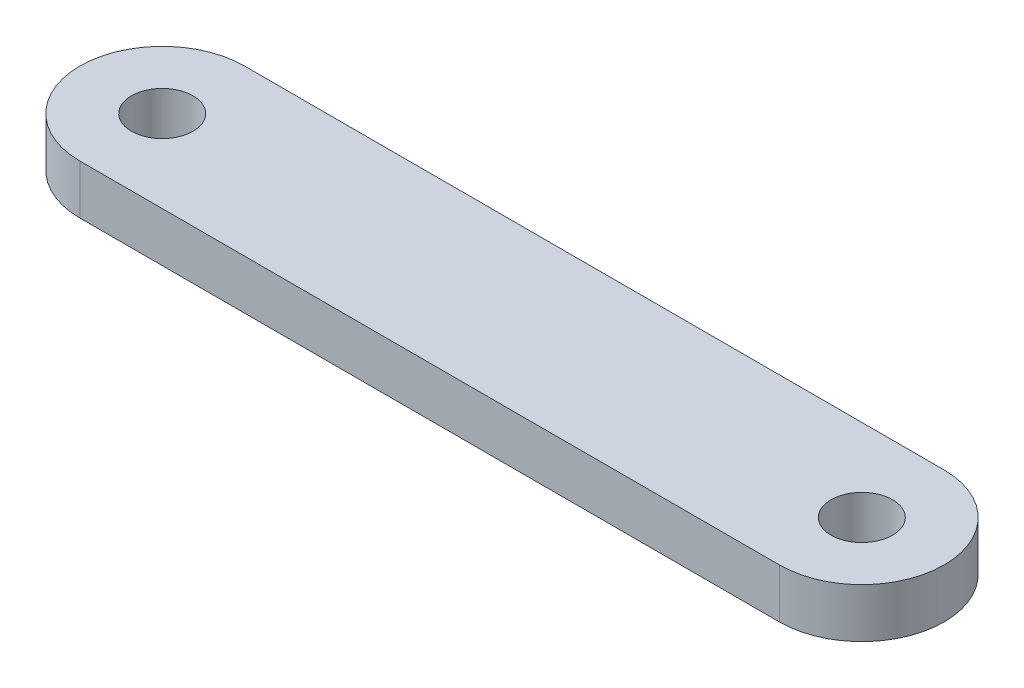
ISO-10303-21;
HEADER;
FILE_DESCRIPTION(('STEP AP214'),'2;1');
FILE_NAME('part.step','',(''),(''),'','','');
FILE_SCHEMA(('AUTOMOTIVE_DESIGN { 1 0 10303 214 1 1 1 1 }'));
ENDSEC;
DATA;
#1=APPLICATION_CONTEXT('core data for automotive mechanical design processes');
#2=APPLICATION_PROTOCOL_DEFINITION('international standard','automotive_design',2000,#1);
#3=PRODUCT_CONTEXT('',#1,'mechanical');
#4=PRODUCT('Part','Part','',(#3));
#5=PRODUCT_RELATED_PRODUCT_CATEGORY('part','',(#4));
#6=PRODUCT_DEFINITION_FORMATION('','',#4);
#7=PRODUCT_DEFINITION_CONTEXT('part definition',#1,'design');
#8=PRODUCT_DEFINITION('design','',#6,#7);
#9=PRODUCT_DEFINITION_SHAPE('','',#8);
#10=(LENGTH_UNIT() NAMED_UNIT(*) SI_UNIT(.MILLI.,.METRE.));
#11=(NAMED_UNIT(*) PLANE_ANGLE_UNIT() SI_UNIT($,.RADIAN.));
#12=(NAMED_UNIT(*) SI_UNIT($,.STERADIAN.) SOLID_ANGLE_UNIT());
#13=UNCERTAINTY_MEASURE_WITH_UNIT(LENGTH_MEASURE(1.E-05),#10,'distance_accuracy_value','');
#14=(GEOMETRIC_REPRESENTATION_CONTEXT(3) GLOBAL_UNCERTAINTY_ASSIGNED_CONTEXT((#13)) GLOBAL_UNIT_ASSIGNED_CONTEXT((#10,
#11,#12)) REPRESENTATION_CONTEXT('',''));
#15=CARTESIAN_POINT('',(0.,0.,0.));
#16=DIRECTION('',(0.,0.,1.));
#17=DIRECTION('',(1.,0.,0.));
#18=AXIS2_PLACEMENT_3D('',#15,#16,#17);
#19=CARTESIAN_POINT('',(-21.59,3.048,0.));
#20=DIRECTION('',(0.,-1.,0.));
#21=DIRECTION('',(0.,0.,-1.));
#22=AXIS2_PLACEMENT_3D('',#19,#20,#21);
#23=CYLINDRICAL_SURFACE('',#22,5.08);
#24=CARTESIAN_POINT('',(-21.59,0.,0.));
#25=DIRECTION('',(0.,1.,0.));
#26=DIRECTION('',(0.,0.,1.));
#27=AXIS2_PLACEMENT_3D('',#24,#25,#26);
#28=CIRCLE('',#27,5.08);
#29=CARTESIAN_POINT('',(-21.59,0.,-5.08));
#30=VERTEX_POINT('',#29);
#31=CARTESIAN_POINT('',(-21.59,0.,5.08));
#32=VERTEX_POINT('',#31);
#33=EDGE_CURVE('E104',#30,#32,#28,.T.);
#34=ORIENTED_EDGE('',*,*,#33,.T.);
#35=DIRECTION('',(0.,-1.,0.));
#36=VECTOR('',#35,1.);
#37=CARTESIAN_POINT('',(-21.59,3.048,5.08));
#38=LINE('',#37,#36);
#39=CARTESIAN_POINT('',(-21.59,3.048,5.08));
#40=VERTEX_POINT('',#39);
#41=EDGE_CURVE('E11',#40,#32,#38,.T.);
#42=ORIENTED_EDGE('',*,*,#41,.F.);
#43=CARTESIAN_POINT('',(-21.59,3.048,0.));
#44=DIRECTION('',(0.,1.,0.));
#45=DIRECTION('',(0.,0.,1.));
#46=AXIS2_PLACEMENT_3D('',#43,#44,#45);
#47=CIRCLE('',#46,5.08);
#48=CARTESIAN_POINT('',(-21.59,3.048,-5.08));
#49=VERTEX_POINT('',#48);
#50=EDGE_CURVE('E92',#49,#40,#47,.T.);
#51=ORIENTED_EDGE('',*,*,#50,.F.);
#52=DIRECTION('',(0.,-1.,0.));
#53=VECTOR('',#52,1.);
#54=CARTESIAN_POINT('',(-21.59,3.048,-5.08));
#55=LINE('',#54,#53);
#56=EDGE_CURVE('E100',#49,#30,#55,.T.);
#57=ORIENTED_EDGE('',*,*,#56,.T.);
#58=EDGE_LOOP('',(#34,#42,#51,#57));
#59=FACE_BOUND('',#58,.T.);
#60=ADVANCED_FACE('F41',(#59),#23,.T.);
#61=CARTESIAN_POINT('',(-21.59,3.048,5.08));
#62=DIRECTION('',(0.,0.,-1.));
#63=DIRECTION('',(-1.,0.,0.));
#64=AXIS2_PLACEMENT_3D('',#61,#62,#63);
#65=PLANE('',#64);
#66=DIRECTION('',(1.,0.,0.));
#67=VECTOR('',#66,1.);
#68=CARTESIAN_POINT('',(-21.59,0.,5.08));
#69=LINE('',#68,#67);
#70=CARTESIAN_POINT('',(21.59,0.,5.07999999999999));
#71=VERTEX_POINT('',#70);
#72=EDGE_CURVE('E96',#32,#71,#69,.T.);
#73=ORIENTED_EDGE('',*,*,#72,.T.);
#74=DIRECTION('',(0.,-1.,0.));
#75=VECTOR('',#74,1.);
#76=CARTESIAN_POINT('',(21.59,3.048,5.07999999999999));
#77=LINE('',#76,#75);
#78=CARTESIAN_POINT('',(21.59,3.048,5.07999999999999));
#79=VERTEX_POINT('',#78);
#80=EDGE_CURVE('E49',#79,#71,#77,.T.);
#81=ORIENTED_EDGE('',*,*,#80,.F.);
#82=DIRECTION('',(1.,0.,0.));
#83=VECTOR('',#82,1.);
#84=CARTESIAN_POINT('',(-21.59,3.048,5.08));
#85=LINE('',#84,#83);
#86=EDGE_CURVE('E87',#40,#79,#85,.T.);
#87=ORIENTED_EDGE('',*,*,#86,.F.);
#88=ORIENTED_EDGE('',*,*,#41,.T.);
#89=EDGE_LOOP('',(#73,#81,#87,#88));
#90=FACE_BOUND('',#89,.T.);
#91=ADVANCED_FACE('F95',(#90),#65,.F.);
#92=CARTESIAN_POINT('',(21.59,3.048,0.));
#93=DIRECTION('',(0.,-1.,0.));
#94=DIRECTION('',(0.,0.,-1.));
#95=AXIS2_PLACEMENT_3D('',#92,#93,#94);
#96=CYLINDRICAL_SURFACE('',#95,5.08);
#97=CARTESIAN_POINT('',(21.59,0.,0.));
#98=DIRECTION('',(0.,1.,0.));
#99=DIRECTION('',(0.,0.,1.));
#100=AXIS2_PLACEMENT_3D('',#97,#98,#99);
#101=CIRCLE('',#100,5.08);
#102=CARTESIAN_POINT('',(21.59,0.,-5.08000000000001));
#103=VERTEX_POINT('',#102);
#104=EDGE_CURVE('E74',#71,#103,#101,.T.);
#105=ORIENTED_EDGE('',*,*,#104,.T.);
#106=DIRECTION('',(0.,-1.,0.));
#107=VECTOR('',#106,1.);
#108=CARTESIAN_POINT('',(21.59,3.048,-5.08000000000001));
#109=LINE('',#108,#107);
#110=CARTESIAN_POINT('',(21.59,3.048,-5.08000000000001));
#111=VERTEX_POINT('',#110);
#112=EDGE_CURVE('E97',#111,#103,#109,.T.);
#113=ORIENTED_EDGE('',*,*,#112,.F.);
#114=CARTESIAN_POINT('',(21.59,3.048,0.));
#115=DIRECTION('',(0.,1.,0.));
#116=DIRECTION('',(0.,0.,1.));
#117=AXIS2_PLACEMENT_3D('',#114,#115,#116);
#118=CIRCLE('',#117,5.08);
#119=EDGE_CURVE('E90',#79,#111,#118,.T.);
#120=ORIENTED_EDGE('',*,*,#119,.F.);
#121=ORIENTED_EDGE('',*,*,#80,.T.);
#122=EDGE_LOOP('',(#105,#113,#120,#121));
#123=FACE_BOUND('',#122,.T.);
#124=ADVANCED_FACE('F98',(#123),#96,.T.);
#125=CARTESIAN_POINT('',(-21.59,3.048,-5.08));
#126=DIRECTION('',(0.,0.,1.));
#127=DIRECTION('',(1.,0.,0.));
#128=AXIS2_PLACEMENT_3D('',#125,#126,#127);
#129=PLANE('',#128);
#130=DIRECTION('',(-1.,0.,0.));
#131=VECTOR('',#130,1.);
#132=CARTESIAN_POINT('',(-21.59,0.,-5.08));
#133=LINE('',#132,#131);
#134=EDGE_CURVE('E80',#103,#30,#133,.T.);
#135=ORIENTED_EDGE('',*,*,#134,.T.);
#136=ORIENTED_EDGE('',*,*,#56,.F.);
#137=DIRECTION('',(-1.,0.,0.));
#138=VECTOR('',#137,1.);
#139=CARTESIAN_POINT('',(-21.59,3.048,-5.08));
#140=LINE('',#139,#138);
#141=EDGE_CURVE('E57',#111,#49,#140,.T.);
#142=ORIENTED_EDGE('',*,*,#141,.F.);
#143=ORIENTED_EDGE('',*,*,#112,.T.);
#144=EDGE_LOOP('',(#135,#136,#142,#143));
#145=FACE_BOUND('',#144,.T.);
#146=ADVANCED_FACE('F112',(#145),#129,.F.);
#147=CARTESIAN_POINT('',(-21.59,3.048,0.));
#148=DIRECTION('',(0.,1.,0.));
#149=DIRECTION('',(0.,0.,1.));
#150=AXIS2_PLACEMENT_3D('',#147,#148,#149);
#151=PLANE('',#150);
#152=CARTESIAN_POINT('',(-21.59,3.048,0.));
#153=DIRECTION('',(0.,1.,0.));
#154=DIRECTION('',(0.,0.,1.));
#155=AXIS2_PLACEMENT_3D('',#152,#153,#154);
#156=CIRCLE('',#155,1.89864999999999);
#157=CARTESIAN_POINT('',(-21.59,3.048,1.89864999999999));
#158=VERTEX_POINT('',#157);
#159=EDGE_CURVE('E126',#158,#158,#156,.T.);
#160=ORIENTED_EDGE('',*,*,#159,.F.);
#161=EDGE_LOOP('',(#160));
#162=FACE_BOUND('',#161,.T.);
#163=CARTESIAN_POINT('',(21.59,3.048,0.));
#164=DIRECTION('',(0.,1.,0.));
#165=DIRECTION('',(0.,0.,1.));
#166=AXIS2_PLACEMENT_3D('',#163,#164,#165);
#167=CIRCLE('',#166,1.89864999999999);
#168=CARTESIAN_POINT('',(21.59,3.048,1.89864999999998));
#169=VERTEX_POINT('',#168);
#170=EDGE_CURVE('E120',#169,#169,#167,.T.);
#171=ORIENTED_EDGE('',*,*,#170,.F.);
#172=EDGE_LOOP('',(#171));
#173=FACE_BOUND('',#172,.T.);
#174=ORIENTED_EDGE('',*,*,#50,.T.);
#175=ORIENTED_EDGE('',*,*,#86,.T.);
#176=ORIENTED_EDGE('',*,*,#119,.T.);
#177=ORIENTED_EDGE('',*,*,#141,.T.);
#178=EDGE_LOOP('',(#174,#175,#176,#177));
#179=FACE_BOUND('',#178,.T.);
#180=ADVANCED_FACE('F88',(#162,#173,#179),#151,.T.);
#181=CARTESIAN_POINT('',(-21.59,0.,0.));
#182=DIRECTION('',(0.,1.,0.));
#183=DIRECTION('',(0.,0.,1.));
#184=AXIS2_PLACEMENT_3D('',#181,#182,#183);
#185=PLANE('',#184);
#186=CARTESIAN_POINT('',(-21.59,0.,0.));
#187=DIRECTION('',(0.,1.,0.));
#188=DIRECTION('',(0.,0.,1.));
#189=AXIS2_PLACEMENT_3D('',#186,#187,#188);
#190=CIRCLE('',#189,1.89865);
#191=CARTESIAN_POINT('',(-21.59,0.,1.89865));
#192=VERTEX_POINT('',#191);
#193=EDGE_CURVE('E123',#192,#192,#190,.T.);
#194=ORIENTED_EDGE('',*,*,#193,.T.);
#195=EDGE_LOOP('',(#194));
#196=FACE_BOUND('',#195,.T.);
#197=CARTESIAN_POINT('',(21.59,0.,0.));
#198=DIRECTION('',(0.,1.,0.));
#199=DIRECTION('',(0.,0.,1.));
#200=AXIS2_PLACEMENT_3D('',#197,#198,#199);
#201=CIRCLE('',#200,1.89865);
#202=CARTESIAN_POINT('',(21.59,0.,1.89864999999999));
#203=VERTEX_POINT('',#202);
#204=EDGE_CURVE('E107',#203,#203,#201,.T.);
#205=ORIENTED_EDGE('',*,*,#204,.T.);
#206=EDGE_LOOP('',(#205));
#207=FACE_BOUND('',#206,.T.);
#208=ORIENTED_EDGE('',*,*,#33,.F.);
#209=ORIENTED_EDGE('',*,*,#134,.F.);
#210=ORIENTED_EDGE('',*,*,#104,.F.);
#211=ORIENTED_EDGE('',*,*,#72,.F.);
#212=EDGE_LOOP('',(#208,#209,#210,#211));
#213=FACE_BOUND('',#212,.T.);
#214=ADVANCED_FACE('F115',(#196,#207,#213),#185,.F.);
#215=CARTESIAN_POINT('',(21.59,3.048,0.));
#216=DIRECTION('',(0.,1.,0.));
#217=DIRECTION('',(0.,0.,1.));
#218=AXIS2_PLACEMENT_3D('',#215,#216,#217);
#219=CYLINDRICAL_SURFACE('',#218,1.89864999999999);
#220=ORIENTED_EDGE('',*,*,#204,.F.);
#221=EDGE_LOOP('',(#220));
#222=FACE_BOUND('',#221,.T.);
#223=ORIENTED_EDGE('',*,*,#170,.T.);
#224=EDGE_LOOP('',(#223));
#225=FACE_BOUND('',#224,.T.);
#226=ADVANCED_FACE('F137',(#222,#225),#219,.F.);
#227=CARTESIAN_POINT('',(-21.59,3.048,0.));
#228=DIRECTION('',(0.,1.,0.));
#229=DIRECTION('',(0.,0.,1.));
#230=AXIS2_PLACEMENT_3D('',#227,#228,#229);
#231=CYLINDRICAL_SURFACE('',#230,1.89864999999999);
#232=ORIENTED_EDGE('',*,*,#193,.F.);
#233=EDGE_LOOP('',(#232));
#234=FACE_BOUND('',#233,.T.);
#235=ORIENTED_EDGE('',*,*,#159,.T.);
#236=EDGE_LOOP('',(#235));
#237=FACE_BOUND('',#236,.T.);
#238=ADVANCED_FACE('F130',(#234,#237),#231,.F.);
#239=CLOSED_SHELL('',(#60,#91,#124,#146,#180,#214,#226,#238));
#240=MANIFOLD_SOLID_BREP('B2',#239);
#241=ADVANCED_BREP_SHAPE_REPRESENTATION('',(#18,#240),#14);
#242=SHAPE_DEFINITION_REPRESENTATION(#9,#241);
ENDSEC;
END-ISO-10303-21;
